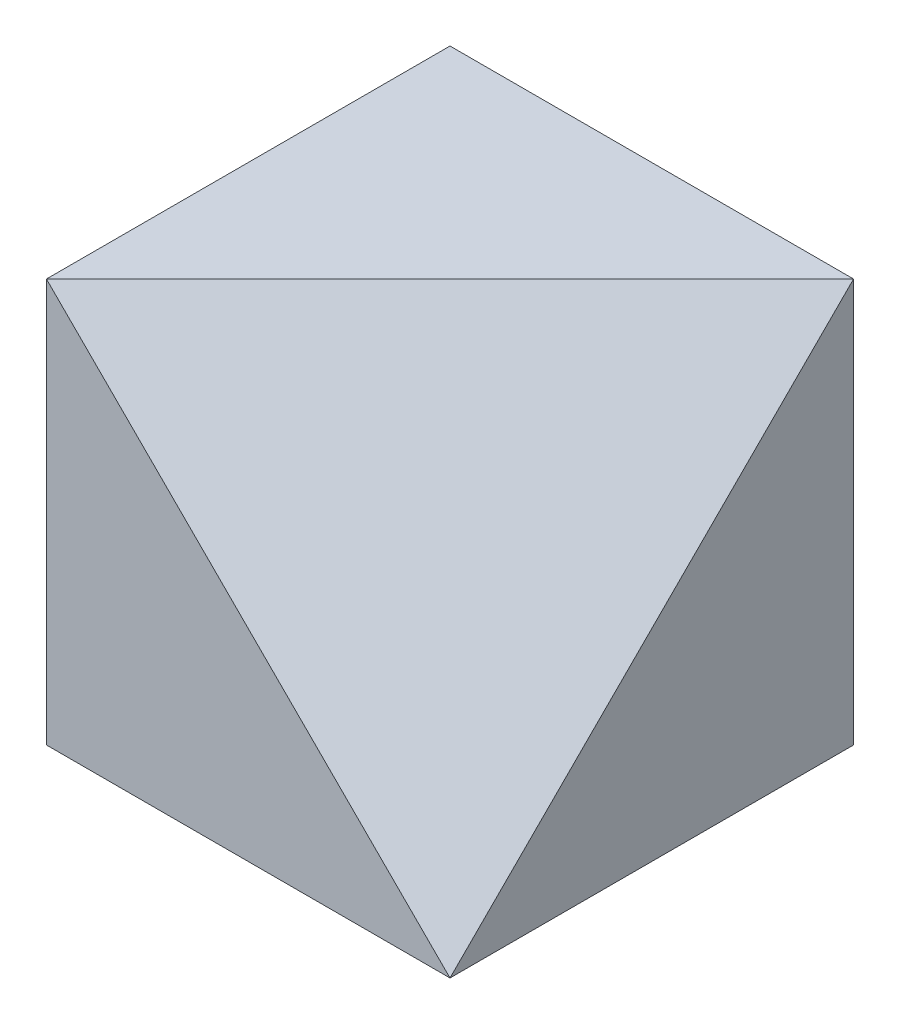
ISO-10303-21;
HEADER;
FILE_DESCRIPTION(('STEP AP214'),'2;1');
FILE_NAME('part.step','',(''),(''),'','','');
FILE_SCHEMA(('AUTOMOTIVE_DESIGN { 1 0 10303 214 1 1 1 1 }'));
ENDSEC;
DATA;
#1=APPLICATION_CONTEXT('core data for automotive mechanical design processes');
#2=APPLICATION_PROTOCOL_DEFINITION('international standard','automotive_design',2000,#1);
#3=PRODUCT_CONTEXT('',#1,'mechanical');
#4=PRODUCT('Part','Part','',(#3));
#5=PRODUCT_RELATED_PRODUCT_CATEGORY('part','',(#4));
#6=PRODUCT_DEFINITION_FORMATION('','',#4);
#7=PRODUCT_DEFINITION_CONTEXT('part definition',#1,'design');
#8=PRODUCT_DEFINITION('design','',#6,#7);
#9=PRODUCT_DEFINITION_SHAPE('','',#8);
#10=(LENGTH_UNIT() NAMED_UNIT(*) SI_UNIT(.MILLI.,.METRE.));
#11=(NAMED_UNIT(*) PLANE_ANGLE_UNIT() SI_UNIT($,.RADIAN.));
#12=(NAMED_UNIT(*) SI_UNIT($,.STERADIAN.) SOLID_ANGLE_UNIT());
#13=UNCERTAINTY_MEASURE_WITH_UNIT(LENGTH_MEASURE(1.E-05),#10,'distance_accuracy_value','');
#14=(GEOMETRIC_REPRESENTATION_CONTEXT(3) GLOBAL_UNCERTAINTY_ASSIGNED_CONTEXT((#13)) GLOBAL_UNIT_ASSIGNED_CONTEXT((#10,
#11,#12)) REPRESENTATION_CONTEXT('',''));
#15=CARTESIAN_POINT('',(0.,0.,0.));
#16=DIRECTION('',(0.,0.,1.));
#17=DIRECTION('',(1.,0.,0.));
#18=AXIS2_PLACEMENT_3D('',#15,#16,#17);
#19=CARTESIAN_POINT('',(40.,80.,-40.));
#20=DIRECTION('',(-1.,0.,0.));
#21=DIRECTION('',(0.,0.,1.));
#22=AXIS2_PLACEMENT_3D('',#19,#20,#21);
#23=PLANE('',#22);
#24=DIRECTION('',(0.,0.707106781186547,-0.707106781186548));
#25=VECTOR('',#24,1.);
#26=CARTESIAN_POINT('',(40.,0.,40.));
#27=LINE('',#26,#25);
#28=CARTESIAN_POINT('',(40.,0.,40.));
#29=VERTEX_POINT('',#28);
#30=CARTESIAN_POINT('',(40.,80.,-40.));
#31=VERTEX_POINT('',#30);
#32=EDGE_CURVE('E47',#29,#31,#27,.T.);
#33=ORIENTED_EDGE('',*,*,#32,.F.);
#34=DIRECTION('',(0.,0.,-1.));
#35=VECTOR('',#34,1.);
#36=CARTESIAN_POINT('',(40.,0.,-40.));
#37=LINE('',#36,#35);
#38=CARTESIAN_POINT('',(40.,0.,-40.));
#39=VERTEX_POINT('',#38);
#40=EDGE_CURVE('E88',#29,#39,#37,.T.);
#41=ORIENTED_EDGE('',*,*,#40,.T.);
#42=DIRECTION('',(0.,-1.,0.));
#43=VECTOR('',#42,1.);
#44=CARTESIAN_POINT('',(40.,80.,-40.));
#45=LINE('',#44,#43);
#46=EDGE_CURVE('E11',#31,#39,#45,.T.);
#47=ORIENTED_EDGE('',*,*,#46,.F.);
#48=EDGE_LOOP('',(#33,#41,#47));
#49=FACE_BOUND('',#48,.T.);
#50=ADVANCED_FACE('F33',(#49),#23,.F.);
#51=CARTESIAN_POINT('',(-40.,80.,40.));
#52=DIRECTION('',(0.,0.,-1.));
#53=DIRECTION('',(-1.,0.,0.));
#54=AXIS2_PLACEMENT_3D('',#51,#52,#53);
#55=PLANE('',#54);
#56=DIRECTION('',(0.707106781186548,-0.707106781186547,0.));
#57=VECTOR('',#56,1.);
#58=CARTESIAN_POINT('',(-40.,80.,40.));
#59=LINE('',#58,#57);
#60=CARTESIAN_POINT('',(-40.,80.,40.));
#61=VERTEX_POINT('',#60);
#62=EDGE_CURVE('E85',#61,#29,#59,.T.);
#63=ORIENTED_EDGE('',*,*,#62,.F.);
#64=DIRECTION('',(0.,-1.,0.));
#65=VECTOR('',#64,1.);
#66=CARTESIAN_POINT('',(-40.,80.,40.));
#67=LINE('',#66,#65);
#68=CARTESIAN_POINT('',(-40.,0.,40.));
#69=VERTEX_POINT('',#68);
#70=EDGE_CURVE('E41',#61,#69,#67,.T.);
#71=ORIENTED_EDGE('',*,*,#70,.T.);
#72=DIRECTION('',(1.,0.,0.));
#73=VECTOR('',#72,1.);
#74=CARTESIAN_POINT('',(-40.,0.,40.));
#75=LINE('',#74,#73);
#76=EDGE_CURVE('E84',#69,#29,#75,.T.);
#77=ORIENTED_EDGE('',*,*,#76,.T.);
#78=EDGE_LOOP('',(#63,#71,#77));
#79=FACE_BOUND('',#78,.T.);
#80=ADVANCED_FACE('F83',(#79),#55,.F.);
#81=CARTESIAN_POINT('',(0.,80.,0.));
#82=DIRECTION('',(0.,1.,0.));
#83=DIRECTION('',(0.,0.,1.));
#84=AXIS2_PLACEMENT_3D('',#81,#82,#83);
#85=PLANE('',#84);
#86=DIRECTION('',(0.,0.,1.));
#87=VECTOR('',#86,1.);
#88=CARTESIAN_POINT('',(-40.,80.,-40.));
#89=LINE('',#88,#87);
#90=CARTESIAN_POINT('',(-40.,80.,-40.0000000000001));
#91=VERTEX_POINT('',#90);
#92=EDGE_CURVE('E78',#91,#61,#89,.T.);
#93=ORIENTED_EDGE('',*,*,#92,.T.);
#94=DIRECTION('',(-0.707106781186547,0.,0.707106781186548));
#95=VECTOR('',#94,1.);
#96=CARTESIAN_POINT('',(-40.,80.,40.));
#97=LINE('',#96,#95);
#98=EDGE_CURVE('E98',#31,#61,#97,.T.);
#99=ORIENTED_EDGE('',*,*,#98,.F.);
#100=DIRECTION('',(-1.,0.,0.));
#101=VECTOR('',#100,1.);
#102=CARTESIAN_POINT('',(-40.,80.,-40.));
#103=LINE('',#102,#101);
#104=EDGE_CURVE('E89',#31,#91,#103,.T.);
#105=ORIENTED_EDGE('',*,*,#104,.T.);
#106=EDGE_LOOP('',(#93,#99,#105));
#107=FACE_BOUND('',#106,.T.);
#108=ADVANCED_FACE('F105',(#107),#85,.T.);
#109=CARTESIAN_POINT('',(-40.,80.,-40.));
#110=DIRECTION('',(0.,0.,1.));
#111=DIRECTION('',(1.,0.,0.));
#112=AXIS2_PLACEMENT_3D('',#109,#110,#111);
#113=PLANE('',#112);
#114=ORIENTED_EDGE('',*,*,#46,.T.);
#115=DIRECTION('',(-0.707106781186548,0.707106781186547,0.));
#116=VECTOR('',#115,1.);
#117=CARTESIAN_POINT('',(40.,0.,-40.));
#118=LINE('',#117,#116);
#119=EDGE_CURVE('E67',#39,#91,#118,.T.);
#120=ORIENTED_EDGE('',*,*,#119,.T.);
#121=ORIENTED_EDGE('',*,*,#104,.F.);
#122=EDGE_LOOP('',(#114,#120,#121));
#123=FACE_BOUND('',#122,.T.);
#124=ADVANCED_FACE('F102',(#123),#113,.F.);
#125=CARTESIAN_POINT('',(-40.,80.,-40.));
#126=DIRECTION('',(1.,0.,0.));
#127=DIRECTION('',(0.,0.,-1.));
#128=AXIS2_PLACEMENT_3D('',#125,#126,#127);
#129=PLANE('',#128);
#130=ORIENTED_EDGE('',*,*,#92,.F.);
#131=DIRECTION('',(0.,-0.707106781186547,0.707106781186548));
#132=VECTOR('',#131,1.);
#133=CARTESIAN_POINT('',(-40.,80.,-40.0000000000001));
#134=LINE('',#133,#132);
#135=EDGE_CURVE('E65',#91,#69,#134,.T.);
#136=ORIENTED_EDGE('',*,*,#135,.T.);
#137=ORIENTED_EDGE('',*,*,#70,.F.);
#138=EDGE_LOOP('',(#130,#136,#137));
#139=FACE_BOUND('',#138,.T.);
#140=ADVANCED_FACE('F76',(#139),#129,.F.);
#141=CARTESIAN_POINT('',(0.,0.,0.));
#142=DIRECTION('',(0.,1.,0.));
#143=DIRECTION('',(0.,0.,1.));
#144=AXIS2_PLACEMENT_3D('',#141,#142,#143);
#145=PLANE('',#144);
#146=ORIENTED_EDGE('',*,*,#76,.F.);
#147=DIRECTION('',(0.707106781186547,0.,-0.707106781186548));
#148=VECTOR('',#147,1.);
#149=CARTESIAN_POINT('',(-40.,0.,40.));
#150=LINE('',#149,#148);
#151=EDGE_CURVE('E62',#69,#39,#150,.T.);
#152=ORIENTED_EDGE('',*,*,#151,.T.);
#153=ORIENTED_EDGE('',*,*,#40,.F.);
#154=EDGE_LOOP('',(#146,#152,#153));
#155=FACE_BOUND('',#154,.T.);
#156=ADVANCED_FACE('F86',(#155),#145,.F.);
#157=CARTESIAN_POINT('',(26.6666666666666,26.6666666666667,26.6666666666666));
#158=DIRECTION('',(0.577350269189626,0.577350269189626,0.577350269189625));
#159=DIRECTION('',(-0.707106781186548,0.707106781186547,0.));
#160=AXIS2_PLACEMENT_3D('',#157,#158,#159);
#161=PLANE('',#160);
#162=ORIENTED_EDGE('',*,*,#98,.T.);
#163=ORIENTED_EDGE('',*,*,#62,.T.);
#164=ORIENTED_EDGE('',*,*,#32,.T.);
#165=EDGE_LOOP('',(#162,#163,#164));
#166=FACE_BOUND('',#165,.T.);
#167=ADVANCED_FACE('F106',(#166),#161,.T.);
#168=CARTESIAN_POINT('',(0.,0.,0.));
#169=DIRECTION('',(0.577350269189626,0.577350269189626,0.577350269189625));
#170=DIRECTION('',(-0.707106781186548,0.707106781186547,0.));
#171=AXIS2_PLACEMENT_3D('',#168,#169,#170);
#172=PLANE('',#171);
#173=ORIENTED_EDGE('',*,*,#135,.F.);
#174=ORIENTED_EDGE('',*,*,#119,.F.);
#175=ORIENTED_EDGE('',*,*,#151,.F.);
#176=EDGE_LOOP('',(#173,#174,#175));
#177=FACE_BOUND('',#176,.T.);
#178=ADVANCED_FACE('F64',(#177),#172,.F.);
#179=CLOSED_SHELL('',(#50,#80,#108,#124,#140,#156,#167,#178));
#180=MANIFOLD_SOLID_BREP('B2',#179);
#181=ADVANCED_BREP_SHAPE_REPRESENTATION('',(#18,#180),#14);
#182=SHAPE_DEFINITION_REPRESENTATION(#9,#181);
ENDSEC;
END-ISO-10303-21;
